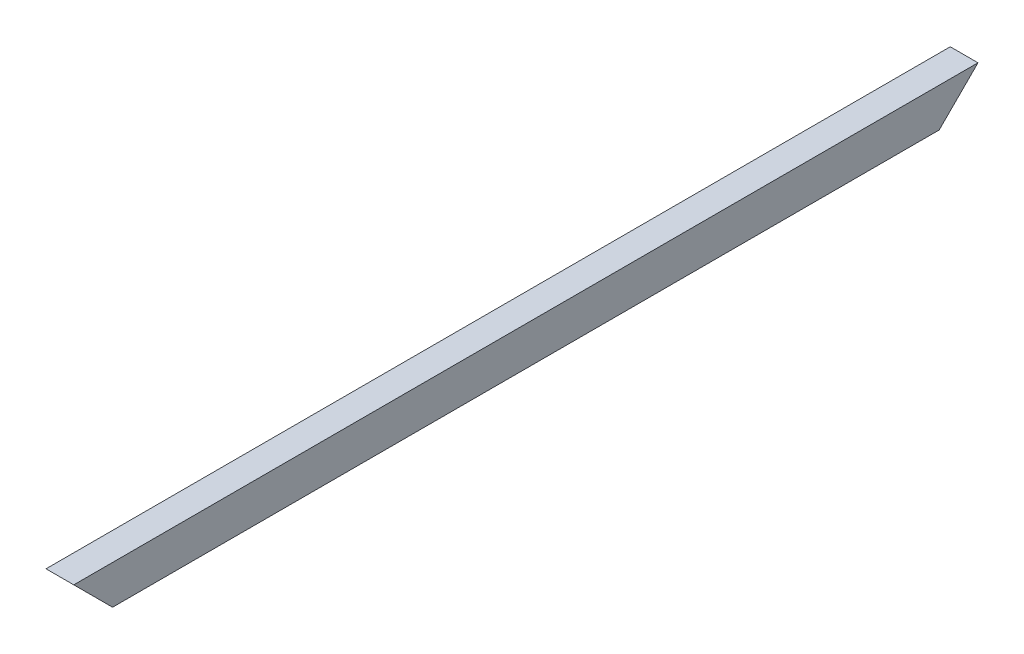
ISO-10303-21;
HEADER;
FILE_DESCRIPTION(('STEP AP214'),'2;1');
FILE_NAME('part.step','',(''),(''),'','','');
FILE_SCHEMA(('AUTOMOTIVE_DESIGN { 1 0 10303 214 1 1 1 1 }'));
ENDSEC;
DATA;
#1=APPLICATION_CONTEXT('core data for automotive mechanical design processes');
#2=APPLICATION_PROTOCOL_DEFINITION('international standard','automotive_design',2000,#1);
#3=PRODUCT_CONTEXT('',#1,'mechanical');
#4=PRODUCT('Part','Part','',(#3));
#5=PRODUCT_RELATED_PRODUCT_CATEGORY('part','',(#4));
#6=PRODUCT_DEFINITION_FORMATION('','',#4);
#7=PRODUCT_DEFINITION_CONTEXT('part definition',#1,'design');
#8=PRODUCT_DEFINITION('design','',#6,#7);
#9=PRODUCT_DEFINITION_SHAPE('','',#8);
#10=(LENGTH_UNIT() NAMED_UNIT(*) SI_UNIT(.MILLI.,.METRE.));
#11=(NAMED_UNIT(*) PLANE_ANGLE_UNIT() SI_UNIT($,.RADIAN.));
#12=(NAMED_UNIT(*) SI_UNIT($,.STERADIAN.) SOLID_ANGLE_UNIT());
#13=UNCERTAINTY_MEASURE_WITH_UNIT(LENGTH_MEASURE(1.E-05),#10,'distance_accuracy_value','');
#14=(GEOMETRIC_REPRESENTATION_CONTEXT(3) GLOBAL_UNCERTAINTY_ASSIGNED_CONTEXT((#13)) GLOBAL_UNIT_ASSIGNED_CONTEXT((#10,
#11,#12)) REPRESENTATION_CONTEXT('',''));
#15=CARTESIAN_POINT('',(0.,0.,0.));
#16=DIRECTION('',(0.,0.,1.));
#17=DIRECTION('',(1.,0.,0.));
#18=AXIS2_PLACEMENT_3D('',#15,#16,#17);
#19=CARTESIAN_POINT('',(-1.45384517799707,87.0444912694272,315.));
#20=DIRECTION('',(1.,0.,0.));
#21=DIRECTION('',(0.,0.,-1.));
#22=AXIS2_PLACEMENT_3D('',#19,#20,#21);
#23=PLANE('',#22);
#24=DIRECTION('',(0.,-0.707106781186547,-0.707106781186547));
#25=VECTOR('',#24,1.);
#26=CARTESIAN_POINT('',(-1.45384517799707,87.0444912694272,315.));
#27=LINE('',#26,#25);
#28=CARTESIAN_POINT('',(-1.45384517799707,87.0444912694272,315.));
#29=VERTEX_POINT('',#28);
#30=CARTESIAN_POINT('',(-1.45384517799707,80.352031959899,308.307540690472));
#31=VERTEX_POINT('',#30);
#32=EDGE_CURVE('E103',#29,#31,#27,.T.);
#33=ORIENTED_EDGE('',*,*,#32,.F.);
#34=DIRECTION('',(0.,0.,-1.));
#35=VECTOR('',#34,1.);
#36=CARTESIAN_POINT('',(-1.45384517799707,87.0444912694272,315.));
#37=LINE('',#36,#35);
#38=CARTESIAN_POINT('',(-1.45384517799707,87.0444912694272,-315.));
#39=VERTEX_POINT('',#38);
#40=EDGE_CURVE('E108',#29,#39,#37,.T.);
#41=ORIENTED_EDGE('',*,*,#40,.T.);
#42=DIRECTION('',(0.,-0.707106781186547,0.707106781186547));
#43=VECTOR('',#42,1.);
#44=CARTESIAN_POINT('',(-1.45384517799707,87.0444912694272,-315.));
#45=LINE('',#44,#43);
#46=CARTESIAN_POINT('',(-1.45384517799707,80.3520319598991,-308.307540690472));
#47=VERTEX_POINT('',#46);
#48=EDGE_CURVE('E166',#39,#47,#45,.T.);
#49=ORIENTED_EDGE('',*,*,#48,.T.);
#50=DIRECTION('',(0.,0.,-1.));
#51=VECTOR('',#50,1.);
#52=CARTESIAN_POINT('',(-1.45384517799707,80.352031959899,315.));
#53=LINE('',#52,#51);
#54=EDGE_CURVE('E11',#31,#47,#53,.T.);
#55=ORIENTED_EDGE('',*,*,#54,.F.);
#56=EDGE_LOOP('',(#33,#41,#49,#55));
#57=FACE_BOUND('',#56,.T.);
#58=ADVANCED_FACE('F37',(#57),#23,.F.);
#59=CARTESIAN_POINT('',(2.41113903886347,80.352031959899,315.));
#60=DIRECTION('',(0.,0.,-1.));
#61=DIRECTION('',(-1.,0.,0.));
#62=AXIS2_PLACEMENT_3D('',#59,#60,#61);
#63=CYLINDRICAL_SURFACE('',#62,3.86498421686055);
#64=CARTESIAN_POINT('',(2.41113903886347,80.352031959899,308.307540690472));
#65=DIRECTION('',(0.,-0.707106781186548,0.707106781186548));
#66=DIRECTION('',(0.,-0.707106781186548,-0.707106781186548));
#67=AXIS2_PLACEMENT_3D('',#64,#65,#66);
#68=ELLIPSE('',#67,5.46591309784214,3.86498421686055);
#69=CARTESIAN_POINT('',(2.41113903886349,76.4870477430385,304.442556473611));
#70=VERTEX_POINT('',#69);
#71=EDGE_CURVE('E171',#31,#70,#68,.T.);
#72=ORIENTED_EDGE('',*,*,#71,.F.);
#73=ORIENTED_EDGE('',*,*,#54,.T.);
#74=CARTESIAN_POINT('',(2.41113903886347,80.352031959899,-308.307540690472));
#75=DIRECTION('',(0.,0.707106781186548,0.707106781186548));
#76=DIRECTION('',(0.,0.707106781186548,-0.707106781186548));
#77=AXIS2_PLACEMENT_3D('',#74,#75,#76);
#78=ELLIPSE('',#77,5.46591309784214,3.86498421686055);
#79=CARTESIAN_POINT('',(2.41113903886349,76.4870477430385,-304.442556473611));
#80=VERTEX_POINT('',#79);
#81=EDGE_CURVE('E148',#47,#80,#78,.T.);
#82=ORIENTED_EDGE('',*,*,#81,.T.);
#83=DIRECTION('',(0.,0.,-1.));
#84=VECTOR('',#83,1.);
#85=CARTESIAN_POINT('',(2.41113903886349,76.4870477430385,315.));
#86=LINE('',#85,#84);
#87=EDGE_CURVE('E45',#70,#80,#86,.T.);
#88=ORIENTED_EDGE('',*,*,#87,.F.);
#89=EDGE_LOOP('',(#72,#73,#82,#88));
#90=FACE_BOUND('',#89,.T.);
#91=ADVANCED_FACE('F153',(#90),#63,.T.);
#92=CARTESIAN_POINT('',(2.41113903886349,76.4870477430385,315.));
#93=DIRECTION('',(1.,0.,0.));
#94=DIRECTION('',(0.,0.,-1.));
#95=AXIS2_PLACEMENT_3D('',#92,#93,#94);
#96=PLANE('',#95);
#97=DIRECTION('',(0.,-0.707106781186548,-0.707106781186548));
#98=VECTOR('',#97,1.);
#99=CARTESIAN_POINT('',(2.41113903886349,81.7657695062328,309.721278236806));
#100=LINE('',#99,#98);
#101=CARTESIAN_POINT('',(2.41113903886349,73.5278151404681,301.483323871041));
#102=VERTEX_POINT('',#101);
#103=EDGE_CURVE('E141',#70,#102,#100,.T.);
#104=ORIENTED_EDGE('',*,*,#103,.F.);
#105=ORIENTED_EDGE('',*,*,#87,.T.);
#106=DIRECTION('',(0.,-0.707106781186548,0.707106781186548));
#107=VECTOR('',#106,1.);
#108=CARTESIAN_POINT('',(2.41113903886349,-233.234230493767,5.27872176319438));
#109=LINE('',#108,#107);
#110=CARTESIAN_POINT('',(2.41113903886349,73.5278151404681,-301.483323871041));
#111=VERTEX_POINT('',#110);
#112=EDGE_CURVE('E140',#80,#111,#109,.T.);
#113=ORIENTED_EDGE('',*,*,#112,.T.);
#114=DIRECTION('',(0.,0.,-1.));
#115=VECTOR('',#114,1.);
#116=CARTESIAN_POINT('',(2.41113903886349,73.5278151404681,315.));
#117=LINE('',#116,#115);
#118=EDGE_CURVE('E132',#102,#111,#117,.T.);
#119=ORIENTED_EDGE('',*,*,#118,.F.);
#120=EDGE_LOOP('',(#104,#105,#113,#119));
#121=FACE_BOUND('',#120,.T.);
#122=ADVANCED_FACE('F138',(#121),#96,.F.);
#123=CARTESIAN_POINT('',(2.41113903886349,67.9576689033391,315.));
#124=DIRECTION('',(0.,0.,-1.));
#125=DIRECTION('',(-1.,0.,0.));
#126=AXIS2_PLACEMENT_3D('',#123,#124,#125);
#127=CYLINDRICAL_SURFACE('',#126,5.57014623712905);
#128=CARTESIAN_POINT('',(2.41113903886349,67.9576689033391,295.913177633912));
#129=DIRECTION('',(0.,-0.707106781186548,0.707106781186548));
#130=DIRECTION('',(0.,-0.707106781186548,-0.707106781186548));
#131=AXIS2_PLACEMENT_3D('',#128,#129,#130);
#132=ELLIPSE('',#131,7.87737635294937,5.57014623712905);
#133=CARTESIAN_POINT('',(7.68803018388197,69.7411904049277,297.696699135501));
#134=VERTEX_POINT('',#133);
#135=EDGE_CURVE('E174',#102,#134,#132,.F.);
#136=ORIENTED_EDGE('',*,*,#135,.F.);
#137=ORIENTED_EDGE('',*,*,#118,.T.);
#138=CARTESIAN_POINT('',(2.41113903886349,67.9576689033391,-295.913177633912));
#139=DIRECTION('',(0.,0.707106781186548,0.707106781186548));
#140=DIRECTION('',(0.,0.707106781186548,-0.707106781186548));
#141=AXIS2_PLACEMENT_3D('',#138,#139,#140);
#142=ELLIPSE('',#141,7.87737635294937,5.57014623712905);
#143=CARTESIAN_POINT('',(7.68803018388197,69.7411904049277,-297.696699135501));
#144=VERTEX_POINT('',#143);
#145=EDGE_CURVE('E151',#111,#144,#142,.F.);
#146=ORIENTED_EDGE('',*,*,#145,.T.);
#147=DIRECTION('',(0.,0.,-1.));
#148=VECTOR('',#147,1.);
#149=CARTESIAN_POINT('',(7.68803018388197,69.7411904049277,315.));
#150=LINE('',#149,#148);
#151=EDGE_CURVE('E130',#134,#144,#150,.T.);
#152=ORIENTED_EDGE('',*,*,#151,.F.);
#153=EDGE_LOOP('',(#136,#137,#146,#152));
#154=FACE_BOUND('',#153,.T.);
#155=ADVANCED_FACE('F201',(#154),#127,.F.);
#156=CARTESIAN_POINT('',(7.68803018388197,69.7411904049277,315.));
#157=DIRECTION('',(1.,0.,0.));
#158=DIRECTION('',(0.,0.,-1.));
#159=AXIS2_PLACEMENT_3D('',#156,#157,#158);
#160=PLANE('',#159);
#161=DIRECTION('',(0.,-0.707106781186548,-0.707106781186548));
#162=VECTOR('',#161,1.);
#163=CARTESIAN_POINT('',(7.68803018388197,78.3928408371774,306.34834956775));
#164=LINE('',#163,#162);
#165=CARTESIAN_POINT('',(7.68803018388194,66.9611159368649,294.916624667438));
#166=VERTEX_POINT('',#165);
#167=EDGE_CURVE('E176',#134,#166,#164,.T.);
#168=ORIENTED_EDGE('',*,*,#167,.F.);
#169=ORIENTED_EDGE('',*,*,#151,.T.);
#170=DIRECTION('',(0.,-0.707106781186548,0.707106781186548));
#171=VECTOR('',#170,1.);
#172=CARTESIAN_POINT('',(7.68803018388197,-236.607159162823,8.65165043224975));
#173=LINE('',#172,#171);
#174=CARTESIAN_POINT('',(7.68803018388194,66.9611159368649,-294.916624667438));
#175=VERTEX_POINT('',#174);
#176=EDGE_CURVE('E157',#144,#175,#173,.T.);
#177=ORIENTED_EDGE('',*,*,#176,.T.);
#178=DIRECTION('',(0.,0.,-1.));
#179=VECTOR('',#178,1.);
#180=CARTESIAN_POINT('',(7.68803018388194,66.9611159368649,315.));
#181=LINE('',#180,#179);
#182=EDGE_CURVE('E128',#166,#175,#181,.T.);
#183=ORIENTED_EDGE('',*,*,#182,.F.);
#184=EDGE_LOOP('',(#168,#169,#177,#183));
#185=FACE_BOUND('',#184,.T.);
#186=ADVANCED_FACE('F197',(#185),#160,.F.);
#187=CARTESIAN_POINT('',(14.6548630067986,66.9611159368649,315.));
#188=DIRECTION('',(0.,0.,-1.));
#189=DIRECTION('',(-1.,0.,0.));
#190=AXIS2_PLACEMENT_3D('',#187,#188,#189);
#191=CYLINDRICAL_SURFACE('',#190,6.96683282291669);
#192=CARTESIAN_POINT('',(14.6548630067986,66.9611159368649,294.916624667438));
#193=DIRECTION('',(0.,-0.707106781186548,0.707106781186548));
#194=DIRECTION('',(0.,-0.707106781186548,-0.707106781186548));
#195=AXIS2_PLACEMENT_3D('',#192,#193,#194);
#196=ELLIPSE('',#195,9.85258946495482,6.96683282291669);
#197=CARTESIAN_POINT('',(14.2156711261576,60.0081403095203,287.963649040093));
#198=VERTEX_POINT('',#197);
#199=EDGE_CURVE('E178',#166,#198,#196,.T.);
#200=ORIENTED_EDGE('',*,*,#199,.F.);
#201=ORIENTED_EDGE('',*,*,#182,.T.);
#202=CARTESIAN_POINT('',(14.6548630067986,66.9611159368649,-294.916624667438));
#203=DIRECTION('',(0.,0.707106781186548,0.707106781186548));
#204=DIRECTION('',(0.,0.707106781186548,-0.707106781186548));
#205=AXIS2_PLACEMENT_3D('',#202,#203,#204);
#206=ELLIPSE('',#205,9.85258946495482,6.96683282291669);
#207=CARTESIAN_POINT('',(14.2156711261576,60.0081403095203,-287.963649040093));
#208=VERTEX_POINT('',#207);
#209=EDGE_CURVE('E160',#175,#208,#206,.T.);
#210=ORIENTED_EDGE('',*,*,#209,.T.);
#211=DIRECTION('',(0.,0.,-1.));
#212=VECTOR('',#211,1.);
#213=CARTESIAN_POINT('',(14.2156711261576,60.0081403095203,315.));
#214=LINE('',#213,#212);
#215=EDGE_CURVE('E126',#198,#208,#214,.T.);
#216=ORIENTED_EDGE('',*,*,#215,.F.);
#217=EDGE_LOOP('',(#200,#201,#210,#216));
#218=FACE_BOUND('',#217,.T.);
#219=ADVANCED_FACE('F193',(#218),#191,.T.);
#220=CARTESIAN_POINT('',(14.2156711261576,60.0081403095203,315.));
#221=DIRECTION('',(0.,1.,0.));
#222=DIRECTION('',(0.,0.,1.));
#223=AXIS2_PLACEMENT_3D('',#220,#221,#222);
#224=PLANE('',#223);
#225=DIRECTION('',(1.,0.,0.));
#226=VECTOR('',#225,1.);
#227=CARTESIAN_POINT('',(14.2156711261576,60.0081403095203,287.963649040093));
#228=LINE('',#227,#226);
#229=CARTESIAN_POINT('',(17.8891392956441,60.0081403095203,287.963649040093));
#230=VERTEX_POINT('',#229);
#231=EDGE_CURVE('E115',#198,#230,#228,.T.);
#232=ORIENTED_EDGE('',*,*,#231,.F.);
#233=ORIENTED_EDGE('',*,*,#215,.T.);
#234=DIRECTION('',(1.,0.,0.));
#235=VECTOR('',#234,1.);
#236=CARTESIAN_POINT('',(14.2156711261576,60.0081403095203,-287.963649040093));
#237=LINE('',#236,#235);
#238=CARTESIAN_POINT('',(17.8891392956441,60.0081403095203,-287.963649040093));
#239=VERTEX_POINT('',#238);
#240=EDGE_CURVE('E163',#208,#239,#237,.T.);
#241=ORIENTED_EDGE('',*,*,#240,.T.);
#242=DIRECTION('',(0.,0.,-1.));
#243=VECTOR('',#242,1.);
#244=CARTESIAN_POINT('',(17.8891392956441,60.0081403095203,315.));
#245=LINE('',#244,#243);
#246=EDGE_CURVE('E121',#230,#239,#245,.T.);
#247=ORIENTED_EDGE('',*,*,#246,.F.);
#248=EDGE_LOOP('',(#232,#233,#241,#247));
#249=FACE_BOUND('',#248,.T.);
#250=ADVANCED_FACE('F187',(#249),#224,.F.);
#251=CARTESIAN_POINT('',(17.8891392956441,60.0081403095203,315.));
#252=DIRECTION('',(-1.,0.,0.));
#253=DIRECTION('',(0.,-1.,0.));
#254=AXIS2_PLACEMENT_3D('',#251,#252,#253);
#255=PLANE('',#254);
#256=DIRECTION('',(0.,-0.707106781186547,-0.707106781186547));
#257=VECTOR('',#256,1.);
#258=CARTESIAN_POINT('',(17.8891392956441,87.0444912694272,315.));
#259=LINE('',#258,#257);
#260=CARTESIAN_POINT('',(17.8891392956441,87.0444912694272,315.));
#261=VERTEX_POINT('',#260);
#262=EDGE_CURVE('E51',#261,#230,#259,.T.);
#263=ORIENTED_EDGE('',*,*,#262,.T.);
#264=ORIENTED_EDGE('',*,*,#246,.T.);
#265=DIRECTION('',(0.,-0.707106781186547,0.707106781186547));
#266=VECTOR('',#265,1.);
#267=CARTESIAN_POINT('',(17.8891392956441,87.0444912694272,-315.));
#268=LINE('',#267,#266);
#269=CARTESIAN_POINT('',(17.8891392956441,87.0444912694272,-315.));
#270=VERTEX_POINT('',#269);
#271=EDGE_CURVE('E168',#270,#239,#268,.T.);
#272=ORIENTED_EDGE('',*,*,#271,.F.);
#273=DIRECTION('',(0.,0.,-1.));
#274=VECTOR('',#273,1.);
#275=CARTESIAN_POINT('',(17.8891392956441,87.0444912694272,315.));
#276=LINE('',#275,#274);
#277=EDGE_CURVE('E119',#261,#270,#276,.T.);
#278=ORIENTED_EDGE('',*,*,#277,.F.);
#279=EDGE_LOOP('',(#263,#264,#272,#278));
#280=FACE_BOUND('',#279,.T.);
#281=ADVANCED_FACE('F183',(#280),#255,.F.);
#282=CARTESIAN_POINT('',(17.8891392956441,87.0444912694272,315.));
#283=DIRECTION('',(0.,-1.,0.));
#284=DIRECTION('',(0.,0.,-1.));
#285=AXIS2_PLACEMENT_3D('',#282,#283,#284);
#286=PLANE('',#285);
#287=DIRECTION('',(-1.,0.,0.));
#288=VECTOR('',#287,1.);
#289=CARTESIAN_POINT('',(17.8891392956441,87.0444912694272,-315.));
#290=LINE('',#289,#288);
#291=EDGE_CURVE('E109',#270,#39,#290,.T.);
#292=ORIENTED_EDGE('',*,*,#291,.T.);
#293=ORIENTED_EDGE('',*,*,#40,.F.);
#294=DIRECTION('',(-1.,0.,0.));
#295=VECTOR('',#294,1.);
#296=CARTESIAN_POINT('',(17.8891392956441,87.0444912694272,315.));
#297=LINE('',#296,#295);
#298=EDGE_CURVE('E100',#261,#29,#297,.T.);
#299=ORIENTED_EDGE('',*,*,#298,.F.);
#300=ORIENTED_EDGE('',*,*,#277,.T.);
#301=EDGE_LOOP('',(#292,#293,#299,#300));
#302=FACE_BOUND('',#301,.T.);
#303=ADVANCED_FACE('F118',(#302),#286,.F.);
#304=CARTESIAN_POINT('',(-1.45384517799707,87.0444912694272,-315.));
#305=DIRECTION('',(0.,0.707106781186548,0.707106781186548));
#306=DIRECTION('',(0.,-0.707106781186548,0.707106781186548));
#307=AXIS2_PLACEMENT_3D('',#304,#305,#306);
#308=PLANE('',#307);
#309=ORIENTED_EDGE('',*,*,#48,.F.);
#310=ORIENTED_EDGE('',*,*,#291,.F.);
#311=ORIENTED_EDGE('',*,*,#271,.T.);
#312=ORIENTED_EDGE('',*,*,#240,.F.);
#313=ORIENTED_EDGE('',*,*,#209,.F.);
#314=ORIENTED_EDGE('',*,*,#176,.F.);
#315=ORIENTED_EDGE('',*,*,#145,.F.);
#316=ORIENTED_EDGE('',*,*,#112,.F.);
#317=ORIENTED_EDGE('',*,*,#81,.F.);
#318=EDGE_LOOP('',(#309,#310,#311,#312,#313,#314,#315,#316,#317));
#319=FACE_BOUND('',#318,.T.);
#320=ADVANCED_FACE('F147',(#319),#308,.F.);
#321=CARTESIAN_POINT('',(-1.45384517799707,87.0444912694272,315.));
#322=DIRECTION('',(0.,-0.707106781186548,0.707106781186548));
#323=DIRECTION('',(0.,-0.707106781186548,-0.707106781186548));
#324=AXIS2_PLACEMENT_3D('',#321,#322,#323);
#325=PLANE('',#324);
#326=ORIENTED_EDGE('',*,*,#71,.T.);
#327=ORIENTED_EDGE('',*,*,#103,.T.);
#328=ORIENTED_EDGE('',*,*,#135,.T.);
#329=ORIENTED_EDGE('',*,*,#167,.T.);
#330=ORIENTED_EDGE('',*,*,#199,.T.);
#331=ORIENTED_EDGE('',*,*,#231,.T.);
#332=ORIENTED_EDGE('',*,*,#262,.F.);
#333=ORIENTED_EDGE('',*,*,#298,.T.);
#334=ORIENTED_EDGE('',*,*,#32,.T.);
#335=EDGE_LOOP('',(#326,#327,#328,#329,#330,#331,#332,#333,#334));
#336=FACE_BOUND('',#335,.T.);
#337=ADVANCED_FACE('F102',(#336),#325,.T.);
#338=CLOSED_SHELL('',(#58,#91,#122,#155,#186,#219,#250,#281,#303,#320,#337));
#339=MANIFOLD_SOLID_BREP('B2',#338);
#340=ADVANCED_BREP_SHAPE_REPRESENTATION('',(#18,#339),#14);
#341=SHAPE_DEFINITION_REPRESENTATION(#9,#340);
ENDSEC;
END-ISO-10303-21;
